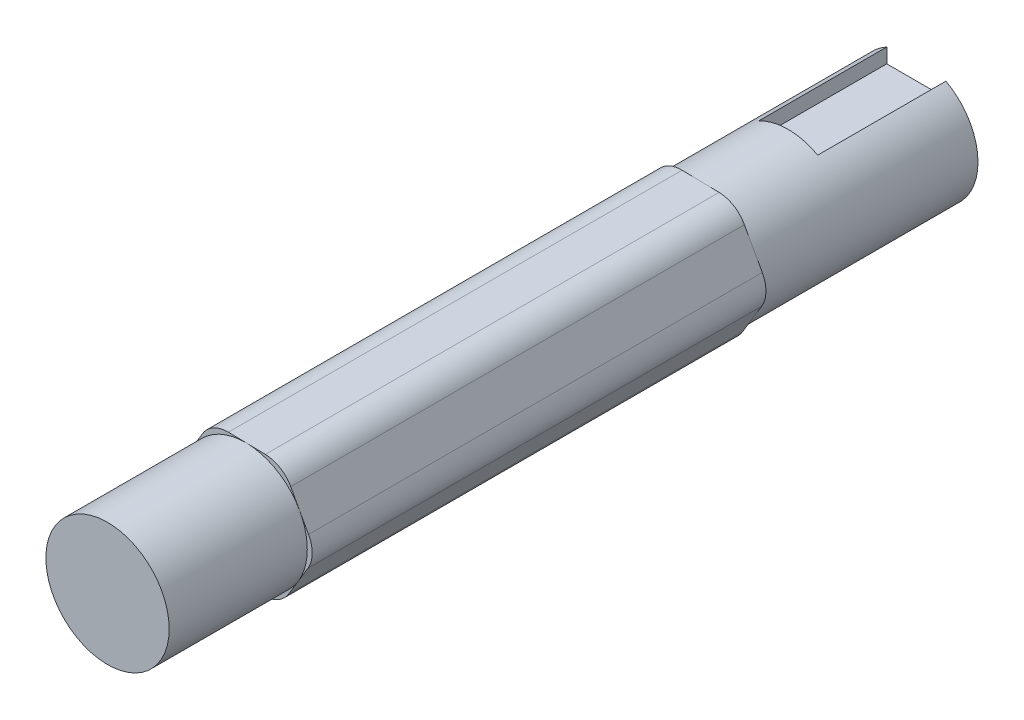
ISO-10303-21;
HEADER;
FILE_DESCRIPTION(('STEP AP214'),'2;1');
FILE_NAME('part.step','',(''),(''),'','','');
FILE_SCHEMA(('AUTOMOTIVE_DESIGN { 1 0 10303 214 1 1 1 1 }'));
ENDSEC;
DATA;
#1=APPLICATION_CONTEXT('core data for automotive mechanical design processes');
#2=APPLICATION_PROTOCOL_DEFINITION('international standard','automotive_design',2000,#1);
#3=PRODUCT_CONTEXT('',#1,'mechanical');
#4=PRODUCT('Part','Part','',(#3));
#5=PRODUCT_RELATED_PRODUCT_CATEGORY('part','',(#4));
#6=PRODUCT_DEFINITION_FORMATION('','',#4);
#7=PRODUCT_DEFINITION_CONTEXT('part definition',#1,'design');
#8=PRODUCT_DEFINITION('design','',#6,#7);
#9=PRODUCT_DEFINITION_SHAPE('','',#8);
#10=(LENGTH_UNIT() NAMED_UNIT(*) SI_UNIT(.MILLI.,.METRE.));
#11=(NAMED_UNIT(*) PLANE_ANGLE_UNIT() SI_UNIT($,.RADIAN.));
#12=(NAMED_UNIT(*) SI_UNIT($,.STERADIAN.) SOLID_ANGLE_UNIT());
#13=UNCERTAINTY_MEASURE_WITH_UNIT(LENGTH_MEASURE(1.E-05),#10,'distance_accuracy_value','');
#14=(GEOMETRIC_REPRESENTATION_CONTEXT(3) GLOBAL_UNCERTAINTY_ASSIGNED_CONTEXT((#13)) GLOBAL_UNIT_ASSIGNED_CONTEXT((#10,
#11,#12)) REPRESENTATION_CONTEXT('',''));
#15=CARTESIAN_POINT('',(0.,0.,0.));
#16=DIRECTION('',(0.,0.,1.));
#17=DIRECTION('',(1.,0.,0.));
#18=AXIS2_PLACEMENT_3D('',#15,#16,#17);
#19=CARTESIAN_POINT('',(0.,0.,-45.));
#20=DIRECTION('',(0.,0.,1.));
#21=DIRECTION('',(1.,0.,0.));
#22=AXIS2_PLACEMENT_3D('',#19,#20,#21);
#23=CYLINDRICAL_SURFACE('',#22,6.25);
#24=DIRECTION('',(0.,0.,1.));
#25=VECTOR('',#24,1.);
#26=CARTESIAN_POINT('',(3.,5.48292804986533,-45.));
#27=LINE('',#26,#25);
#28=CARTESIAN_POINT('',(3.,5.48292804986533,-32.));
#29=VERTEX_POINT('',#28);
#30=CARTESIAN_POINT('',(3.,5.48292804986533,-45.));
#31=VERTEX_POINT('',#30);
#32=EDGE_CURVE('E269',#29,#31,#27,.F.);
#33=ORIENTED_EDGE('',*,*,#32,.F.);
#34=CARTESIAN_POINT('',(0.,0.,-32.));
#35=DIRECTION('',(0.,0.,-1.));
#36=DIRECTION('',(-1.,0.,0.));
#37=AXIS2_PLACEMENT_3D('',#34,#35,#36);
#38=CIRCLE('',#37,6.25);
#39=CARTESIAN_POINT('',(-3.,5.48292804986533,-32.));
#40=VERTEX_POINT('',#39);
#41=EDGE_CURVE('E229',#29,#40,#38,.F.);
#42=ORIENTED_EDGE('',*,*,#41,.T.);
#43=DIRECTION('',(0.,0.,1.));
#44=VECTOR('',#43,1.);
#45=CARTESIAN_POINT('',(-3.,5.48292804986533,-45.));
#46=LINE('',#45,#44);
#47=CARTESIAN_POINT('',(-3.,5.48292804986533,-45.));
#48=VERTEX_POINT('',#47);
#49=EDGE_CURVE('E264',#48,#40,#46,.T.);
#50=ORIENTED_EDGE('',*,*,#49,.F.);
#51=CARTESIAN_POINT('',(0.,0.,-45.));
#52=DIRECTION('',(0.,0.,1.));
#53=DIRECTION('',(1.,0.,0.));
#54=AXIS2_PLACEMENT_3D('',#51,#52,#53);
#55=CIRCLE('',#54,6.25);
#56=EDGE_CURVE('E276',#48,#31,#55,.T.);
#57=ORIENTED_EDGE('',*,*,#56,.T.);
#58=EDGE_LOOP('',(#33,#42,#50,#57));
#59=FACE_BOUND('',#58,.T.);
#60=CARTESIAN_POINT('',(0.,0.,-23.));
#61=DIRECTION('',(0.,0.,1.));
#62=DIRECTION('',(1.,0.,0.));
#63=AXIS2_PLACEMENT_3D('',#60,#61,#62);
#64=CIRCLE('',#63,6.25);
#65=CARTESIAN_POINT('',(5.4741641454902,3.01596202035596,-23.));
#66=VERTEX_POINT('',#65);
#67=CARTESIAN_POINT('',(5.3489817992224,-3.23278420430246,-23.));
#68=VERTEX_POINT('',#67);
#69=EDGE_CURVE('E219',#66,#68,#64,.F.);
#70=ORIENTED_EDGE('',*,*,#69,.T.);
#71=CARTESIAN_POINT('',(-0.125182346267798,-6.24874622465843,-23.));
#72=VERTEX_POINT('',#71);
#73=EDGE_CURVE('E291',#68,#72,#64,.F.);
#74=ORIENTED_EDGE('',*,*,#73,.T.);
#75=CARTESIAN_POINT('',(-5.47416414549019,-3.01596202035596,-23.));
#76=VERTEX_POINT('',#75);
#77=EDGE_CURVE('E362',#72,#76,#64,.F.);
#78=ORIENTED_EDGE('',*,*,#77,.T.);
#79=CARTESIAN_POINT('',(-5.3489817992224,3.23278420430246,-23.));
#80=VERTEX_POINT('',#79);
#81=EDGE_CURVE('E365',#76,#80,#64,.F.);
#82=ORIENTED_EDGE('',*,*,#81,.T.);
#83=CARTESIAN_POINT('',(0.125182346267799,6.24874622465842,-23.));
#84=VERTEX_POINT('',#83);
#85=EDGE_CURVE('E368',#80,#84,#64,.F.);
#86=ORIENTED_EDGE('',*,*,#85,.T.);
#87=EDGE_CURVE('E290',#84,#66,#64,.F.);
#88=ORIENTED_EDGE('',*,*,#87,.T.);
#89=EDGE_LOOP('',(#70,#74,#78,#82,#86,#88));
#90=FACE_BOUND('',#89,.T.);
#91=ADVANCED_FACE('F40',(#59,#90),#23,.T.);
#92=CARTESIAN_POINT('',(0.,0.,-45.));
#93=DIRECTION('',(0.,0.,1.));
#94=DIRECTION('',(1.,0.,0.));
#95=AXIS2_PLACEMENT_3D('',#92,#93,#94);
#96=PLANE('',#95);
#97=DIRECTION('',(-1.,0.,0.));
#98=VECTOR('',#97,1.);
#99=CARTESIAN_POINT('',(3.,4.,-45.));
#100=LINE('',#99,#98);
#101=CARTESIAN_POINT('',(3.,4.,-45.));
#102=VERTEX_POINT('',#101);
#103=CARTESIAN_POINT('',(-3.,4.,-45.));
#104=VERTEX_POINT('',#103);
#105=EDGE_CURVE('E254',#102,#104,#100,.T.);
#106=ORIENTED_EDGE('',*,*,#105,.F.);
#107=DIRECTION('',(0.,1.,0.));
#108=VECTOR('',#107,1.);
#109=CARTESIAN_POINT('',(3.,0.,-45.));
#110=LINE('',#109,#108);
#111=EDGE_CURVE('E280',#102,#31,#110,.T.);
#112=ORIENTED_EDGE('',*,*,#111,.T.);
#113=ORIENTED_EDGE('',*,*,#56,.F.);
#114=DIRECTION('',(0.,1.,0.));
#115=VECTOR('',#114,1.);
#116=CARTESIAN_POINT('',(-3.,8.5,-45.));
#117=LINE('',#116,#115);
#118=EDGE_CURVE('E245',#104,#48,#117,.T.);
#119=ORIENTED_EDGE('',*,*,#118,.F.);
#120=EDGE_LOOP('',(#106,#112,#113,#119));
#121=FACE_BOUND('',#120,.T.);
#122=ADVANCED_FACE('F516',(#121),#96,.F.);
#123=CARTESIAN_POINT('',(3.,8.5,-32.));
#124=DIRECTION('',(1.,0.,0.));
#125=DIRECTION('',(0.,0.,-1.));
#126=AXIS2_PLACEMENT_3D('',#123,#124,#125);
#127=PLANE('',#126);
#128=ORIENTED_EDGE('',*,*,#32,.T.);
#129=ORIENTED_EDGE('',*,*,#111,.F.);
#130=DIRECTION('',(0.,0.,-1.));
#131=VECTOR('',#130,1.);
#132=CARTESIAN_POINT('',(3.,4.,-32.));
#133=LINE('',#132,#131);
#134=CARTESIAN_POINT('',(3.,4.,-32.));
#135=VERTEX_POINT('',#134);
#136=EDGE_CURVE('E253',#135,#102,#133,.T.);
#137=ORIENTED_EDGE('',*,*,#136,.F.);
#138=DIRECTION('',(0.,-1.,0.));
#139=VECTOR('',#138,1.);
#140=CARTESIAN_POINT('',(3.,8.5,-32.));
#141=LINE('',#140,#139);
#142=EDGE_CURVE('E241',#29,#135,#141,.T.);
#143=ORIENTED_EDGE('',*,*,#142,.F.);
#144=EDGE_LOOP('',(#128,#129,#137,#143));
#145=FACE_BOUND('',#144,.T.);
#146=ADVANCED_FACE('F522',(#145),#127,.F.);
#147=CARTESIAN_POINT('',(-3.,8.5,-32.));
#148=DIRECTION('',(-1.,0.,0.));
#149=DIRECTION('',(0.,0.,1.));
#150=AXIS2_PLACEMENT_3D('',#147,#148,#149);
#151=PLANE('',#150);
#152=ORIENTED_EDGE('',*,*,#49,.T.);
#153=DIRECTION('',(0.,1.,0.));
#154=VECTOR('',#153,1.);
#155=CARTESIAN_POINT('',(-3.,8.5,-32.));
#156=LINE('',#155,#154);
#157=CARTESIAN_POINT('',(-3.,4.,-32.));
#158=VERTEX_POINT('',#157);
#159=EDGE_CURVE('E249',#158,#40,#156,.T.);
#160=ORIENTED_EDGE('',*,*,#159,.F.);
#161=DIRECTION('',(0.,0.,-1.));
#162=VECTOR('',#161,1.);
#163=CARTESIAN_POINT('',(-3.,4.,-32.));
#164=LINE('',#163,#162);
#165=EDGE_CURVE('E261',#158,#104,#164,.T.);
#166=ORIENTED_EDGE('',*,*,#165,.T.);
#167=ORIENTED_EDGE('',*,*,#118,.T.);
#168=EDGE_LOOP('',(#152,#160,#166,#167));
#169=FACE_BOUND('',#168,.T.);
#170=ADVANCED_FACE('F541',(#169),#151,.F.);
#171=CARTESIAN_POINT('',(3.,4.,-32.));
#172=DIRECTION('',(0.,-1.,0.));
#173=DIRECTION('',(0.,0.,-1.));
#174=AXIS2_PLACEMENT_3D('',#171,#172,#173);
#175=PLANE('',#174);
#176=ORIENTED_EDGE('',*,*,#105,.T.);
#177=ORIENTED_EDGE('',*,*,#165,.F.);
#178=DIRECTION('',(-1.,0.,0.));
#179=VECTOR('',#178,1.);
#180=CARTESIAN_POINT('',(3.,4.,-32.));
#181=LINE('',#180,#179);
#182=EDGE_CURVE('E244',#135,#158,#181,.T.);
#183=ORIENTED_EDGE('',*,*,#182,.F.);
#184=ORIENTED_EDGE('',*,*,#136,.T.);
#185=EDGE_LOOP('',(#176,#177,#183,#184));
#186=FACE_BOUND('',#185,.T.);
#187=ADVANCED_FACE('F543',(#186),#175,.F.);
#188=CARTESIAN_POINT('',(0.,0.,-32.));
#189=DIRECTION('',(0.,0.,-1.));
#190=DIRECTION('',(-1.,0.,0.));
#191=AXIS2_PLACEMENT_3D('',#188,#189,#190);
#192=PLANE('',#191);
#193=ORIENTED_EDGE('',*,*,#142,.T.);
#194=ORIENTED_EDGE('',*,*,#182,.T.);
#195=ORIENTED_EDGE('',*,*,#159,.T.);
#196=ORIENTED_EDGE('',*,*,#41,.F.);
#197=EDGE_LOOP('',(#193,#194,#195,#196));
#198=FACE_BOUND('',#197,.T.);
#199=ADVANCED_FACE('F546',(#198),#192,.T.);
#200=CARTESIAN_POINT('',(7.2154306298084,-0.144548122631002,42.1851751755642));
#201=DIRECTION('',(-0.875866263278431,-0.482553923256953,0.));
#202=DIRECTION('',(0.482553923256953,-0.875866263278431,0.));
#203=AXIS2_PLACEMENT_3D('',#200,#201,#202);
#204=PLANE('',#203);
#205=DIRECTION('',(-0.482553923256953,0.875866263278431,0.));
#206=VECTOR('',#205,1.);
#207=CARTESIAN_POINT('',(7.2154306298084,-0.144548122631002,23.));
#208=LINE('',#207,#206);
#209=CARTESIAN_POINT('',(6.37962271733566,1.37249674600274,23.));
#210=VERTEX_POINT('',#209);
#211=CARTESIAN_POINT('',(5.4741641454902,3.01596202035596,23.));
#212=VERTEX_POINT('',#211);
#213=EDGE_CURVE('E226',#210,#212,#208,.T.);
#214=ORIENTED_EDGE('',*,*,#213,.F.);
#215=DIRECTION('',(0.,0.,-1.));
#216=VECTOR('',#215,1.);
#217=CARTESIAN_POINT('',(6.37962271733566,1.37249674600274,42.1851751755642));
#218=LINE('',#217,#216);
#219=CARTESIAN_POINT('',(6.37962271733566,1.37249674600274,-23.));
#220=VERTEX_POINT('',#219);
#221=EDGE_CURVE('E351',#210,#220,#218,.T.);
#222=ORIENTED_EDGE('',*,*,#221,.T.);
#223=DIRECTION('',(-0.482553923256953,0.875866263278431,0.));
#224=VECTOR('',#223,1.);
#225=CARTESIAN_POINT('',(7.2154306298084,-0.144548122631002,-23.));
#226=LINE('',#225,#224);
#227=EDGE_CURVE('E430',#220,#66,#226,.T.);
#228=ORIENTED_EDGE('',*,*,#227,.T.);
#229=CARTESIAN_POINT('',(4.56870557364473,4.65942729470918,-23.));
#230=VERTEX_POINT('',#229);
#231=EDGE_CURVE('E434',#66,#230,#226,.T.);
#232=ORIENTED_EDGE('',*,*,#231,.T.);
#233=DIRECTION('',(0.,0.,-1.));
#234=VECTOR('',#233,1.);
#235=CARTESIAN_POINT('',(4.56870557364473,4.65942729470918,42.1851751755642));
#236=LINE('',#235,#234);
#237=CARTESIAN_POINT('',(4.56870557364473,4.65942729470918,23.));
#238=VERTEX_POINT('',#237);
#239=EDGE_CURVE('E348',#230,#238,#236,.F.);
#240=ORIENTED_EDGE('',*,*,#239,.T.);
#241=EDGE_CURVE('E203',#212,#238,#208,.T.);
#242=ORIENTED_EDGE('',*,*,#241,.F.);
#243=EDGE_LOOP('',(#214,#222,#228,#232,#240,#242));
#244=FACE_BOUND('',#243,.T.);
#245=ADVANCED_FACE('F438',(#244),#204,.F.);
#246=CARTESIAN_POINT('',(3.732897661172,6.17647216334292,42.1851751755642));
#247=DIRECTION('',(-0.0200291754028479,-0.999799395945348,0.));
#248=DIRECTION('',(0.999799395945348,-0.0200291754028479,0.));
#249=AXIS2_PLACEMENT_3D('',#246,#247,#248);
#250=PLANE('',#249);
#251=DIRECTION('',(-0.999799395945348,0.0200291754028479,0.));
#252=VECTOR('',#251,1.);
#253=CARTESIAN_POINT('',(3.732897661172,6.17647216334292,-23.));
#254=LINE('',#253,#252);
#255=CARTESIAN_POINT('',(-1.75082961748238,6.28632873654248,-23.));
#256=VERTEX_POINT('',#255);
#257=EDGE_CURVE('E423',#84,#256,#254,.T.);
#258=ORIENTED_EDGE('',*,*,#257,.T.);
#259=DIRECTION('',(0.,0.,-1.));
#260=VECTOR('',#259,1.);
#261=CARTESIAN_POINT('',(-1.75082961748238,6.28632873654248,42.1851751755642));
#262=LINE('',#261,#260);
#263=CARTESIAN_POINT('',(-1.75082961748238,6.28632873654248,23.));
#264=VERTEX_POINT('',#263);
#265=EDGE_CURVE('E306',#256,#264,#262,.F.);
#266=ORIENTED_EDGE('',*,*,#265,.T.);
#267=DIRECTION('',(-0.999799395945348,0.0200291754028479,0.));
#268=VECTOR('',#267,1.);
#269=CARTESIAN_POINT('',(3.732897661172,6.17647216334292,23.));
#270=LINE('',#269,#268);
#271=CARTESIAN_POINT('',(0.125182346267799,6.24874622465842,23.));
#272=VERTEX_POINT('',#271);
#273=EDGE_CURVE('E399',#272,#264,#270,.T.);
#274=ORIENTED_EDGE('',*,*,#273,.F.);
#275=CARTESIAN_POINT('',(2.00119431001798,6.21116371277436,23.));
#276=VERTEX_POINT('',#275);
#277=EDGE_CURVE('E397',#276,#272,#270,.T.);
#278=ORIENTED_EDGE('',*,*,#277,.F.);
#279=DIRECTION('',(0.,0.,-1.));
#280=VECTOR('',#279,1.);
#281=CARTESIAN_POINT('',(2.00119431001798,6.21116371277436,42.1851751755642));
#282=LINE('',#281,#280);
#283=CARTESIAN_POINT('',(2.00119431001798,6.21116371277436,-23.));
#284=VERTEX_POINT('',#283);
#285=EDGE_CURVE('E302',#276,#284,#282,.T.);
#286=ORIENTED_EDGE('',*,*,#285,.T.);
#287=EDGE_CURVE('E416',#284,#84,#254,.T.);
#288=ORIENTED_EDGE('',*,*,#287,.T.);
#289=EDGE_LOOP('',(#258,#266,#274,#278,#286,#288));
#290=FACE_BOUND('',#289,.T.);
#291=ADVANCED_FACE('F415',(#290),#250,.F.);
#292=CARTESIAN_POINT('',(-3.4825329686364,6.32102028597393,42.1851751755642));
#293=DIRECTION('',(0.855837087875584,-0.517245472688394,0.));
#294=DIRECTION('',(0.517245472688394,0.855837087875584,0.));
#295=AXIS2_PLACEMENT_3D('',#292,#293,#294);
#296=PLANE('',#295);
#297=DIRECTION('',(-0.517245472688394,-0.855837087875584,0.));
#298=VECTOR('',#297,1.);
#299=CARTESIAN_POINT('',(-3.4825329686364,6.32102028597393,23.));
#300=LINE('',#299,#298);
#301=CARTESIAN_POINT('',(-4.37842840731768,4.83866696677162,23.));
#302=VERTEX_POINT('',#301);
#303=CARTESIAN_POINT('',(-5.3489817992224,3.23278420430246,23.));
#304=VERTEX_POINT('',#303);
#305=EDGE_CURVE('E391',#302,#304,#300,.T.);
#306=ORIENTED_EDGE('',*,*,#305,.F.);
#307=DIRECTION('',(0.,0.,-1.));
#308=VECTOR('',#307,1.);
#309=CARTESIAN_POINT('',(-4.37842840731768,4.83866696677162,42.1851751755642));
#310=LINE('',#309,#308);
#311=CARTESIAN_POINT('',(-4.37842840731768,4.83866696677162,-23.));
#312=VERTEX_POINT('',#311);
#313=EDGE_CURVE('E295',#302,#312,#310,.T.);
#314=ORIENTED_EDGE('',*,*,#313,.T.);
#315=DIRECTION('',(-0.517245472688394,-0.855837087875584,0.));
#316=VECTOR('',#315,1.);
#317=CARTESIAN_POINT('',(-3.4825329686364,6.32102028597393,-23.));
#318=LINE('',#317,#316);
#319=EDGE_CURVE('E428',#312,#80,#318,.T.);
#320=ORIENTED_EDGE('',*,*,#319,.T.);
#321=CARTESIAN_POINT('',(-6.31953519112711,1.6269014418333,-23.));
#322=VERTEX_POINT('',#321);
#323=EDGE_CURVE('E422',#80,#322,#318,.T.);
#324=ORIENTED_EDGE('',*,*,#323,.T.);
#325=DIRECTION('',(0.,0.,-1.));
#326=VECTOR('',#325,1.);
#327=CARTESIAN_POINT('',(-6.31953519112711,1.6269014418333,42.1851751755642));
#328=LINE('',#327,#326);
#329=CARTESIAN_POINT('',(-6.31953519112711,1.6269014418333,23.));
#330=VERTEX_POINT('',#329);
#331=EDGE_CURVE('E292',#322,#330,#328,.F.);
#332=ORIENTED_EDGE('',*,*,#331,.T.);
#333=EDGE_CURVE('E393',#304,#330,#300,.T.);
#334=ORIENTED_EDGE('',*,*,#333,.F.);
#335=EDGE_LOOP('',(#306,#314,#320,#324,#332,#334));
#336=FACE_BOUND('',#335,.T.);
#337=ADVANCED_FACE('F453',(#336),#296,.F.);
#338=CARTESIAN_POINT('',(-7.21543062980839,0.144548122631002,42.1851751755642));
#339=DIRECTION('',(0.875866263278431,0.482553923256954,0.));
#340=DIRECTION('',(-0.482553923256954,0.875866263278431,0.));
#341=AXIS2_PLACEMENT_3D('',#338,#339,#340);
#342=PLANE('',#341);
#343=DIRECTION('',(0.482553923256954,-0.875866263278431,0.));
#344=VECTOR('',#343,1.);
#345=CARTESIAN_POINT('',(-7.21543062980839,0.144548122631002,23.));
#346=LINE('',#345,#344);
#347=CARTESIAN_POINT('',(-6.37962271733566,-1.37249674600274,23.));
#348=VERTEX_POINT('',#347);
#349=CARTESIAN_POINT('',(-5.47416414549019,-3.01596202035596,23.));
#350=VERTEX_POINT('',#349);
#351=EDGE_CURVE('E385',#348,#350,#346,.T.);
#352=ORIENTED_EDGE('',*,*,#351,.F.);
#353=DIRECTION('',(0.,0.,-1.));
#354=VECTOR('',#353,1.);
#355=CARTESIAN_POINT('',(-6.37962271733566,-1.37249674600274,42.1851751755642));
#356=LINE('',#355,#354);
#357=CARTESIAN_POINT('',(-6.37962271733566,-1.37249674600274,-23.));
#358=VERTEX_POINT('',#357);
#359=EDGE_CURVE('E315',#348,#358,#356,.T.);
#360=ORIENTED_EDGE('',*,*,#359,.T.);
#361=DIRECTION('',(0.482553923256954,-0.875866263278431,0.));
#362=VECTOR('',#361,1.);
#363=CARTESIAN_POINT('',(-7.21543062980839,0.144548122631002,-23.));
#364=LINE('',#363,#362);
#365=EDGE_CURVE('E488',#358,#76,#364,.T.);
#366=ORIENTED_EDGE('',*,*,#365,.T.);
#367=CARTESIAN_POINT('',(-4.56870557364473,-4.65942729470918,-23.));
#368=VERTEX_POINT('',#367);
#369=EDGE_CURVE('E490',#76,#368,#364,.T.);
#370=ORIENTED_EDGE('',*,*,#369,.T.);
#371=DIRECTION('',(0.,0.,-1.));
#372=VECTOR('',#371,1.);
#373=CARTESIAN_POINT('',(-4.56870557364473,-4.65942729470918,42.1851751755642));
#374=LINE('',#373,#372);
#375=CARTESIAN_POINT('',(-4.56870557364473,-4.65942729470918,23.));
#376=VERTEX_POINT('',#375);
#377=EDGE_CURVE('E312',#368,#376,#374,.F.);
#378=ORIENTED_EDGE('',*,*,#377,.T.);
#379=EDGE_CURVE('E387',#350,#376,#346,.T.);
#380=ORIENTED_EDGE('',*,*,#379,.F.);
#381=EDGE_LOOP('',(#352,#360,#366,#370,#378,#380));
#382=FACE_BOUND('',#381,.T.);
#383=ADVANCED_FACE('F464',(#382),#342,.F.);
#384=CARTESIAN_POINT('',(-3.73289766117199,-6.17647216334292,42.1851751755642));
#385=DIRECTION('',(0.0200291754028477,0.999799395945348,0.));
#386=DIRECTION('',(-0.999799395945348,0.0200291754028477,0.));
#387=AXIS2_PLACEMENT_3D('',#384,#385,#386);
#388=PLANE('',#387);
#389=DIRECTION('',(0.999799395945348,-0.0200291754028477,0.));
#390=VECTOR('',#389,1.);
#391=CARTESIAN_POINT('',(-3.73289766117199,-6.17647216334292,23.));
#392=LINE('',#391,#390);
#393=CARTESIAN_POINT('',(-2.00119431001797,-6.21116371277436,23.));
#394=VERTEX_POINT('',#393);
#395=CARTESIAN_POINT('',(-0.125182346267798,-6.24874622465843,23.));
#396=VERTEX_POINT('',#395);
#397=EDGE_CURVE('E258',#394,#396,#392,.T.);
#398=ORIENTED_EDGE('',*,*,#397,.F.);
#399=DIRECTION('',(0.,0.,-1.));
#400=VECTOR('',#399,1.);
#401=CARTESIAN_POINT('',(-2.00119431001797,-6.21116371277436,42.1851751755642));
#402=LINE('',#401,#400);
#403=CARTESIAN_POINT('',(-2.00119431001797,-6.21116371277436,-23.));
#404=VERTEX_POINT('',#403);
#405=EDGE_CURVE('E328',#394,#404,#402,.T.);
#406=ORIENTED_EDGE('',*,*,#405,.T.);
#407=DIRECTION('',(0.999799395945348,-0.0200291754028477,0.));
#408=VECTOR('',#407,1.);
#409=CARTESIAN_POINT('',(-3.73289766117199,-6.17647216334292,-23.));
#410=LINE('',#409,#408);
#411=EDGE_CURVE('E478',#404,#72,#410,.T.);
#412=ORIENTED_EDGE('',*,*,#411,.T.);
#413=CARTESIAN_POINT('',(1.75082961748238,-6.28632873654249,-23.));
#414=VERTEX_POINT('',#413);
#415=EDGE_CURVE('E484',#72,#414,#410,.T.);
#416=ORIENTED_EDGE('',*,*,#415,.T.);
#417=DIRECTION('',(0.,0.,-1.));
#418=VECTOR('',#417,1.);
#419=CARTESIAN_POINT('',(1.75082961748238,-6.28632873654249,42.1851751755642));
#420=LINE('',#419,#418);
#421=CARTESIAN_POINT('',(1.75082961748238,-6.28632873654249,23.));
#422=VERTEX_POINT('',#421);
#423=EDGE_CURVE('E325',#414,#422,#420,.F.);
#424=ORIENTED_EDGE('',*,*,#423,.T.);
#425=EDGE_CURVE('E382',#396,#422,#392,.T.);
#426=ORIENTED_EDGE('',*,*,#425,.F.);
#427=EDGE_LOOP('',(#398,#406,#412,#416,#424,#426));
#428=FACE_BOUND('',#427,.T.);
#429=ADVANCED_FACE('F476',(#428),#388,.F.);
#430=CARTESIAN_POINT('',(3.4825329686364,-6.32102028597393,42.1851751755642));
#431=DIRECTION('',(-0.855837087875584,0.517245472688394,0.));
#432=DIRECTION('',(-0.517245472688394,-0.855837087875584,0.));
#433=AXIS2_PLACEMENT_3D('',#430,#431,#432);
#434=PLANE('',#433);
#435=DIRECTION('',(0.517245472688394,0.855837087875584,0.));
#436=VECTOR('',#435,1.);
#437=CARTESIAN_POINT('',(3.4825329686364,-6.32102028597393,23.));
#438=LINE('',#437,#436);
#439=CARTESIAN_POINT('',(4.37842840731768,-4.83866696677163,23.));
#440=VERTEX_POINT('',#439);
#441=CARTESIAN_POINT('',(5.3489817992224,-3.23278420430246,23.));
#442=VERTEX_POINT('',#441);
#443=EDGE_CURVE('E190',#440,#442,#438,.T.);
#444=ORIENTED_EDGE('',*,*,#443,.F.);
#445=DIRECTION('',(0.,0.,-1.));
#446=VECTOR('',#445,1.);
#447=CARTESIAN_POINT('',(4.37842840731768,-4.83866696677163,42.1851751755642));
#448=LINE('',#447,#446);
#449=CARTESIAN_POINT('',(4.37842840731768,-4.83866696677163,-23.));
#450=VERTEX_POINT('',#449);
#451=EDGE_CURVE('E340',#440,#450,#448,.T.);
#452=ORIENTED_EDGE('',*,*,#451,.T.);
#453=DIRECTION('',(0.517245472688394,0.855837087875584,0.));
#454=VECTOR('',#453,1.);
#455=CARTESIAN_POINT('',(3.4825329686364,-6.32102028597393,-23.));
#456=LINE('',#455,#454);
#457=EDGE_CURVE('E234',#450,#68,#456,.T.);
#458=ORIENTED_EDGE('',*,*,#457,.T.);
#459=CARTESIAN_POINT('',(6.31953519112712,-1.6269014418333,-23.));
#460=VERTEX_POINT('',#459);
#461=EDGE_CURVE('E236',#68,#460,#456,.T.);
#462=ORIENTED_EDGE('',*,*,#461,.T.);
#463=DIRECTION('',(0.,0.,-1.));
#464=VECTOR('',#463,1.);
#465=CARTESIAN_POINT('',(6.31953519112712,-1.6269014418333,42.1851751755642));
#466=LINE('',#465,#464);
#467=CARTESIAN_POINT('',(6.31953519112712,-1.6269014418333,23.));
#468=VERTEX_POINT('',#467);
#469=EDGE_CURVE('E232',#460,#468,#466,.F.);
#470=ORIENTED_EDGE('',*,*,#469,.T.);
#471=EDGE_CURVE('E204',#442,#468,#438,.T.);
#472=ORIENTED_EDGE('',*,*,#471,.F.);
#473=EDGE_LOOP('',(#444,#452,#458,#462,#470,#472));
#474=FACE_BOUND('',#473,.T.);
#475=ADVANCED_FACE('F230',(#474),#434,.F.);
#476=CARTESIAN_POINT('',(0.,0.,-23.));
#477=DIRECTION('',(0.,0.,1.));
#478=DIRECTION('',(1.,0.,0.));
#479=AXIS2_PLACEMENT_3D('',#476,#477,#478);
#480=PLANE('',#479);
#481=ORIENTED_EDGE('',*,*,#457,.F.);
#482=CARTESIAN_POINT('',(1.81091714369093,-3.28693054870644,-23.));
#483=DIRECTION('',(0.,0.,1.));
#484=DIRECTION('',(1.,0.,0.));
#485=AXIS2_PLACEMENT_3D('',#482,#483,#484);
#486=CIRCLE('',#485,3.);
#487=EDGE_CURVE('E343',#450,#414,#486,.F.);
#488=ORIENTED_EDGE('',*,*,#487,.T.);
#489=ORIENTED_EDGE('',*,*,#415,.F.);
#490=ORIENTED_EDGE('',*,*,#73,.F.);
#491=EDGE_LOOP('',(#481,#488,#489,#490));
#492=FACE_BOUND('',#491,.T.);
#493=ADVANCED_FACE('F496',(#492),#480,.F.);
#494=ORIENTED_EDGE('',*,*,#411,.F.);
#495=CARTESIAN_POINT('',(-1.94110678380943,-3.21176552493832,-23.));
#496=DIRECTION('',(0.,0.,1.));
#497=DIRECTION('',(1.,0.,0.));
#498=AXIS2_PLACEMENT_3D('',#495,#496,#497);
#499=CIRCLE('',#498,3.);
#500=EDGE_CURVE('E332',#404,#368,#499,.F.);
#501=ORIENTED_EDGE('',*,*,#500,.T.);
#502=ORIENTED_EDGE('',*,*,#369,.F.);
#503=ORIENTED_EDGE('',*,*,#77,.F.);
#504=EDGE_LOOP('',(#494,#501,#502,#503));
#505=FACE_BOUND('',#504,.T.);
#506=ADVANCED_FACE('F481',(#505),#480,.F.);
#507=ORIENTED_EDGE('',*,*,#365,.F.);
#508=CARTESIAN_POINT('',(-3.75202392750036,0.0751650237681221,-23.));
#509=DIRECTION('',(0.,0.,1.));
#510=DIRECTION('',(1.,0.,0.));
#511=AXIS2_PLACEMENT_3D('',#508,#509,#510);
#512=CIRCLE('',#511,3.);
#513=EDGE_CURVE('E319',#358,#322,#512,.F.);
#514=ORIENTED_EDGE('',*,*,#513,.T.);
#515=ORIENTED_EDGE('',*,*,#323,.F.);
#516=ORIENTED_EDGE('',*,*,#81,.F.);
#517=EDGE_LOOP('',(#507,#514,#515,#516));
#518=FACE_BOUND('',#517,.T.);
#519=ADVANCED_FACE('F448',(#518),#480,.F.);
#520=ORIENTED_EDGE('',*,*,#319,.F.);
#521=CARTESIAN_POINT('',(-1.81091714369093,3.28693054870644,-23.));
#522=DIRECTION('',(0.,0.,1.));
#523=DIRECTION('',(1.,0.,0.));
#524=AXIS2_PLACEMENT_3D('',#521,#522,#523);
#525=CIRCLE('',#524,3.);
#526=EDGE_CURVE('E299',#312,#256,#525,.F.);
#527=ORIENTED_EDGE('',*,*,#526,.T.);
#528=ORIENTED_EDGE('',*,*,#257,.F.);
#529=ORIENTED_EDGE('',*,*,#85,.F.);
#530=EDGE_LOOP('',(#520,#527,#528,#529));
#531=FACE_BOUND('',#530,.T.);
#532=ADVANCED_FACE('F445',(#531),#480,.F.);
#533=ORIENTED_EDGE('',*,*,#287,.F.);
#534=CARTESIAN_POINT('',(1.94110678380944,3.21176552493832,-23.));
#535=DIRECTION('',(0.,0.,1.));
#536=DIRECTION('',(1.,0.,0.));
#537=AXIS2_PLACEMENT_3D('',#534,#535,#536);
#538=CIRCLE('',#537,3.);
#539=EDGE_CURVE('E49',#284,#230,#538,.F.);
#540=ORIENTED_EDGE('',*,*,#539,.T.);
#541=ORIENTED_EDGE('',*,*,#231,.F.);
#542=ORIENTED_EDGE('',*,*,#87,.F.);
#543=EDGE_LOOP('',(#533,#540,#541,#542));
#544=FACE_BOUND('',#543,.T.);
#545=ADVANCED_FACE('F419',(#544),#480,.F.);
#546=CARTESIAN_POINT('',(0.,0.,23.));
#547=DIRECTION('',(0.,0.,1.));
#548=DIRECTION('',(1.,0.,0.));
#549=AXIS2_PLACEMENT_3D('',#546,#547,#548);
#550=PLANE('',#549);
#551=ORIENTED_EDGE('',*,*,#425,.T.);
#552=CARTESIAN_POINT('',(1.81091714369093,-3.28693054870644,23.));
#553=DIRECTION('',(0.,0.,1.));
#554=DIRECTION('',(1.,0.,0.));
#555=AXIS2_PLACEMENT_3D('',#552,#553,#554);
#556=CIRCLE('',#555,3.);
#557=EDGE_CURVE('E197',#422,#440,#556,.T.);
#558=ORIENTED_EDGE('',*,*,#557,.T.);
#559=ORIENTED_EDGE('',*,*,#443,.T.);
#560=CARTESIAN_POINT('',(0.,0.,23.));
#561=DIRECTION('',(0.,0.,1.));
#562=DIRECTION('',(1.,0.,0.));
#563=AXIS2_PLACEMENT_3D('',#560,#561,#562);
#564=CIRCLE('',#563,6.25);
#565=EDGE_CURVE('E194',#442,#396,#564,.F.);
#566=ORIENTED_EDGE('',*,*,#565,.T.);
#567=EDGE_LOOP('',(#551,#558,#559,#566));
#568=FACE_BOUND('',#567,.T.);
#569=ADVANCED_FACE('F193',(#568),#550,.T.);
#570=ORIENTED_EDGE('',*,*,#379,.T.);
#571=CARTESIAN_POINT('',(-1.94110678380943,-3.21176552493832,23.));
#572=DIRECTION('',(0.,0.,1.));
#573=DIRECTION('',(1.,0.,0.));
#574=AXIS2_PLACEMENT_3D('',#571,#572,#573);
#575=CIRCLE('',#574,3.);
#576=EDGE_CURVE('E335',#376,#394,#575,.T.);
#577=ORIENTED_EDGE('',*,*,#576,.T.);
#578=ORIENTED_EDGE('',*,*,#397,.T.);
#579=EDGE_CURVE('E217',#396,#350,#564,.F.);
#580=ORIENTED_EDGE('',*,*,#579,.T.);
#581=EDGE_LOOP('',(#570,#577,#578,#580));
#582=FACE_BOUND('',#581,.T.);
#583=ADVANCED_FACE('F469',(#582),#550,.T.);
#584=ORIENTED_EDGE('',*,*,#333,.T.);
#585=CARTESIAN_POINT('',(-3.75202392750036,0.0751650237681221,23.));
#586=DIRECTION('',(0.,0.,1.));
#587=DIRECTION('',(1.,0.,0.));
#588=AXIS2_PLACEMENT_3D('',#585,#586,#587);
#589=CIRCLE('',#588,3.);
#590=EDGE_CURVE('E322',#330,#348,#589,.T.);
#591=ORIENTED_EDGE('',*,*,#590,.T.);
#592=ORIENTED_EDGE('',*,*,#351,.T.);
#593=EDGE_CURVE('E374',#350,#304,#564,.F.);
#594=ORIENTED_EDGE('',*,*,#593,.T.);
#595=EDGE_LOOP('',(#584,#591,#592,#594));
#596=FACE_BOUND('',#595,.T.);
#597=ADVANCED_FACE('F461',(#596),#550,.T.);
#598=ORIENTED_EDGE('',*,*,#273,.T.);
#599=CARTESIAN_POINT('',(-1.81091714369093,3.28693054870644,23.));
#600=DIRECTION('',(0.,0.,1.));
#601=DIRECTION('',(1.,0.,0.));
#602=AXIS2_PLACEMENT_3D('',#599,#600,#601);
#603=CIRCLE('',#602,3.);
#604=EDGE_CURVE('E309',#264,#302,#603,.T.);
#605=ORIENTED_EDGE('',*,*,#604,.T.);
#606=ORIENTED_EDGE('',*,*,#305,.T.);
#607=EDGE_CURVE('E377',#304,#272,#564,.F.);
#608=ORIENTED_EDGE('',*,*,#607,.T.);
#609=EDGE_LOOP('',(#598,#605,#606,#608));
#610=FACE_BOUND('',#609,.T.);
#611=ADVANCED_FACE('F511',(#610),#550,.T.);
#612=ORIENTED_EDGE('',*,*,#241,.T.);
#613=CARTESIAN_POINT('',(1.94110678380944,3.21176552493832,23.));
#614=DIRECTION('',(0.,0.,1.));
#615=DIRECTION('',(1.,0.,0.));
#616=AXIS2_PLACEMENT_3D('',#613,#614,#615);
#617=CIRCLE('',#616,3.);
#618=EDGE_CURVE('E11',#238,#276,#617,.T.);
#619=ORIENTED_EDGE('',*,*,#618,.T.);
#620=ORIENTED_EDGE('',*,*,#277,.T.);
#621=EDGE_CURVE('E228',#272,#212,#564,.F.);
#622=ORIENTED_EDGE('',*,*,#621,.T.);
#623=EDGE_LOOP('',(#612,#619,#620,#622));
#624=FACE_BOUND('',#623,.T.);
#625=ADVANCED_FACE('F407',(#624),#550,.T.);
#626=ORIENTED_EDGE('',*,*,#227,.F.);
#627=CARTESIAN_POINT('',(3.75202392750036,-0.0751650237681201,-23.));
#628=DIRECTION('',(0.,0.,1.));
#629=DIRECTION('',(1.,0.,0.));
#630=AXIS2_PLACEMENT_3D('',#627,#628,#629);
#631=CIRCLE('',#630,3.);
#632=EDGE_CURVE('E63',#220,#460,#631,.F.);
#633=ORIENTED_EDGE('',*,*,#632,.T.);
#634=ORIENTED_EDGE('',*,*,#461,.F.);
#635=ORIENTED_EDGE('',*,*,#69,.F.);
#636=EDGE_LOOP('',(#626,#633,#634,#635));
#637=FACE_BOUND('',#636,.T.);
#638=ADVANCED_FACE('F502',(#637),#480,.F.);
#639=ORIENTED_EDGE('',*,*,#471,.T.);
#640=CARTESIAN_POINT('',(3.75202392750036,-0.0751650237681201,23.));
#641=DIRECTION('',(0.,0.,1.));
#642=DIRECTION('',(1.,0.,0.));
#643=AXIS2_PLACEMENT_3D('',#640,#641,#642);
#644=CIRCLE('',#643,3.);
#645=EDGE_CURVE('E356',#468,#210,#644,.T.);
#646=ORIENTED_EDGE('',*,*,#645,.T.);
#647=ORIENTED_EDGE('',*,*,#213,.T.);
#648=EDGE_CURVE('E213',#212,#442,#564,.F.);
#649=ORIENTED_EDGE('',*,*,#648,.T.);
#650=EDGE_LOOP('',(#639,#646,#647,#649));
#651=FACE_BOUND('',#650,.T.);
#652=ADVANCED_FACE('F223',(#651),#550,.T.);
#653=CARTESIAN_POINT('',(0.,0.,37.));
#654=DIRECTION('',(0.,0.,1.));
#655=DIRECTION('',(1.,0.,0.));
#656=AXIS2_PLACEMENT_3D('',#653,#654,#655);
#657=PLANE('',#656);
#658=CARTESIAN_POINT('',(0.,0.,37.));
#659=DIRECTION('',(0.,0.,1.));
#660=DIRECTION('',(1.,0.,0.));
#661=AXIS2_PLACEMENT_3D('',#658,#659,#660);
#662=CIRCLE('',#661,6.25);
#663=CARTESIAN_POINT('',(6.25,0.,37.));
#664=VERTEX_POINT('',#663);
#665=EDGE_CURVE('E272',#664,#664,#662,.T.);
#666=ORIENTED_EDGE('',*,*,#665,.T.);
#667=EDGE_LOOP('',(#666));
#668=FACE_BOUND('',#667,.T.);
#669=ADVANCED_FACE('F509',(#668),#657,.T.);
#670=ORIENTED_EDGE('',*,*,#565,.F.);
#671=ORIENTED_EDGE('',*,*,#648,.F.);
#672=ORIENTED_EDGE('',*,*,#621,.F.);
#673=ORIENTED_EDGE('',*,*,#607,.F.);
#674=ORIENTED_EDGE('',*,*,#593,.F.);
#675=ORIENTED_EDGE('',*,*,#579,.F.);
#676=EDGE_LOOP('',(#670,#671,#672,#673,#674,#675));
#677=FACE_BOUND('',#676,.T.);
#678=ORIENTED_EDGE('',*,*,#665,.F.);
#679=EDGE_LOOP('',(#678));
#680=FACE_BOUND('',#679,.T.);
#681=ADVANCED_FACE('F210',(#677,#680),#23,.T.);
#682=CARTESIAN_POINT('',(-1.81091714369093,3.28693054870644,42.1851751755642));
#683=DIRECTION('',(0.,0.,-1.));
#684=DIRECTION('',(-1.,0.,0.));
#685=AXIS2_PLACEMENT_3D('',#682,#683,#684);
#686=CYLINDRICAL_SURFACE('',#685,3.);
#687=ORIENTED_EDGE('',*,*,#604,.F.);
#688=ORIENTED_EDGE('',*,*,#265,.F.);
#689=ORIENTED_EDGE('',*,*,#526,.F.);
#690=ORIENTED_EDGE('',*,*,#313,.F.);
#691=EDGE_LOOP('',(#687,#688,#689,#690));
#692=FACE_BOUND('',#691,.T.);
#693=ADVANCED_FACE('F528',(#692),#686,.T.);
#694=CARTESIAN_POINT('',(-3.75202392750036,0.0751650237681221,42.1851751755642));
#695=DIRECTION('',(0.,0.,-1.));
#696=DIRECTION('',(-1.,0.,0.));
#697=AXIS2_PLACEMENT_3D('',#694,#695,#696);
#698=CYLINDRICAL_SURFACE('',#697,3.);
#699=ORIENTED_EDGE('',*,*,#590,.F.);
#700=ORIENTED_EDGE('',*,*,#331,.F.);
#701=ORIENTED_EDGE('',*,*,#513,.F.);
#702=ORIENTED_EDGE('',*,*,#359,.F.);
#703=EDGE_LOOP('',(#699,#700,#701,#702));
#704=FACE_BOUND('',#703,.T.);
#705=ADVANCED_FACE('F457',(#704),#698,.T.);
#706=CARTESIAN_POINT('',(-1.94110678380943,-3.21176552493832,42.1851751755642));
#707=DIRECTION('',(0.,0.,-1.));
#708=DIRECTION('',(-1.,0.,0.));
#709=AXIS2_PLACEMENT_3D('',#706,#707,#708);
#710=CYLINDRICAL_SURFACE('',#709,3.);
#711=ORIENTED_EDGE('',*,*,#576,.F.);
#712=ORIENTED_EDGE('',*,*,#377,.F.);
#713=ORIENTED_EDGE('',*,*,#500,.F.);
#714=ORIENTED_EDGE('',*,*,#405,.F.);
#715=EDGE_LOOP('',(#711,#712,#713,#714));
#716=FACE_BOUND('',#715,.T.);
#717=ADVANCED_FACE('F473',(#716),#710,.T.);
#718=CARTESIAN_POINT('',(1.81091714369093,-3.28693054870644,42.1851751755642));
#719=DIRECTION('',(0.,0.,-1.));
#720=DIRECTION('',(-1.,0.,0.));
#721=AXIS2_PLACEMENT_3D('',#718,#719,#720);
#722=CYLINDRICAL_SURFACE('',#721,3.);
#723=ORIENTED_EDGE('',*,*,#557,.F.);
#724=ORIENTED_EDGE('',*,*,#423,.F.);
#725=ORIENTED_EDGE('',*,*,#487,.F.);
#726=ORIENTED_EDGE('',*,*,#451,.F.);
#727=EDGE_LOOP('',(#723,#724,#725,#726));
#728=FACE_BOUND('',#727,.T.);
#729=ADVANCED_FACE('F499',(#728),#722,.T.);
#730=CARTESIAN_POINT('',(3.75202392750036,-0.0751650237681201,42.1851751755642));
#731=DIRECTION('',(0.,0.,-1.));
#732=DIRECTION('',(-1.,0.,0.));
#733=AXIS2_PLACEMENT_3D('',#730,#731,#732);
#734=CYLINDRICAL_SURFACE('',#733,3.);
#735=ORIENTED_EDGE('',*,*,#645,.F.);
#736=ORIENTED_EDGE('',*,*,#469,.F.);
#737=ORIENTED_EDGE('',*,*,#632,.F.);
#738=ORIENTED_EDGE('',*,*,#221,.F.);
#739=EDGE_LOOP('',(#735,#736,#737,#738));
#740=FACE_BOUND('',#739,.T.);
#741=ADVANCED_FACE('F657',(#740),#734,.T.);
#742=CARTESIAN_POINT('',(1.94110678380944,3.21176552493832,42.1851751755642));
#743=DIRECTION('',(0.,0.,-1.));
#744=DIRECTION('',(-1.,0.,0.));
#745=AXIS2_PLACEMENT_3D('',#742,#743,#744);
#746=CYLINDRICAL_SURFACE('',#745,3.);
#747=ORIENTED_EDGE('',*,*,#618,.F.);
#748=ORIENTED_EDGE('',*,*,#239,.F.);
#749=ORIENTED_EDGE('',*,*,#539,.F.);
#750=ORIENTED_EDGE('',*,*,#285,.F.);
#751=EDGE_LOOP('',(#747,#748,#749,#750));
#752=FACE_BOUND('',#751,.T.);
#753=ADVANCED_FACE('F42',(#752),#746,.T.);
#754=CLOSED_SHELL('',(#91,#122,#146,#170,#187,#199,#245,#291,#337,#383,#429,#475,#493,#506,#519,
#532,#545,#569,#583,#597,#611,#625,#638,#652,#669,#681,#693,#705,#717,#729,#741,#753));
#755=MANIFOLD_SOLID_BREP('B2',#754);
#756=ADVANCED_BREP_SHAPE_REPRESENTATION('',(#18,#755),#14);
#757=SHAPE_DEFINITION_REPRESENTATION(#9,#756);
ENDSEC;
END-ISO-10303-21;
